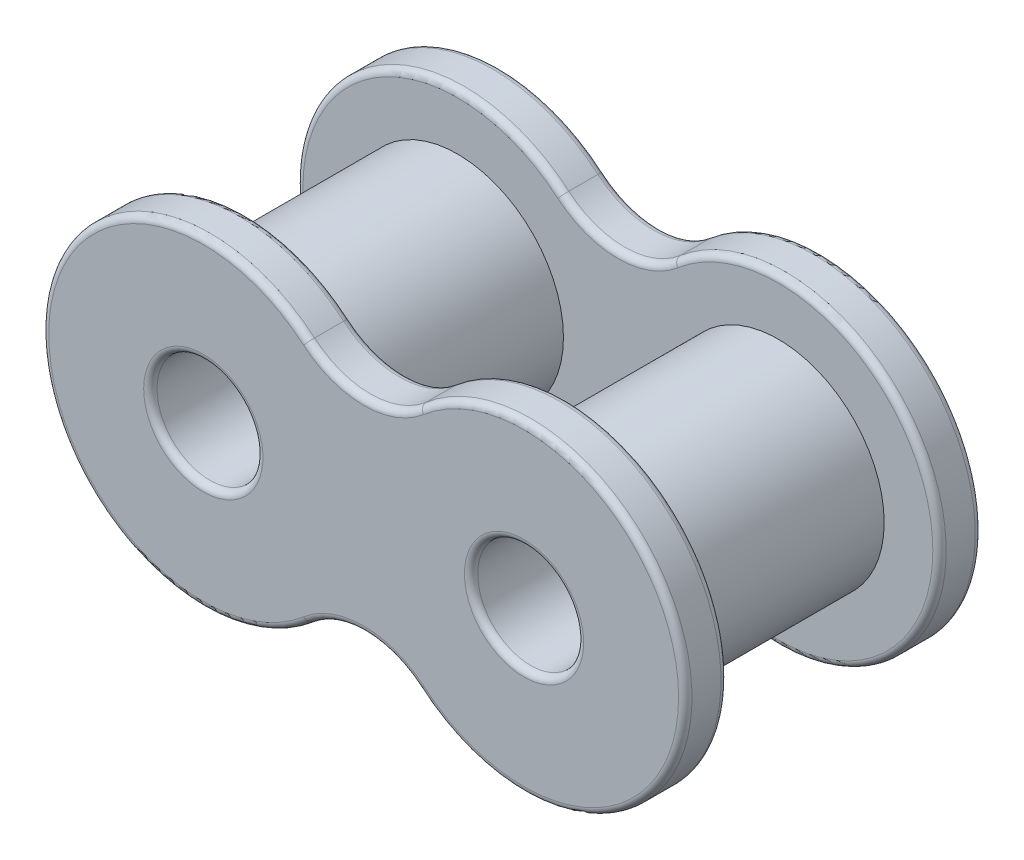
ISO-10303-21;
HEADER;
FILE_DESCRIPTION(('STEP AP214'),'2;1');
FILE_NAME('part.step','',(''),(''),'','','');
FILE_SCHEMA(('AUTOMOTIVE_DESIGN { 1 0 10303 214 1 1 1 1 }'));
ENDSEC;
DATA;
#1=APPLICATION_CONTEXT('core data for automotive mechanical design processes');
#2=APPLICATION_PROTOCOL_DEFINITION('international standard','automotive_design',2000,#1);
#3=PRODUCT_CONTEXT('',#1,'mechanical');
#4=PRODUCT('Part','Part','',(#3));
#5=PRODUCT_RELATED_PRODUCT_CATEGORY('part','',(#4));
#6=PRODUCT_DEFINITION_FORMATION('','',#4);
#7=PRODUCT_DEFINITION_CONTEXT('part definition',#1,'design');
#8=PRODUCT_DEFINITION('design','',#6,#7);
#9=PRODUCT_DEFINITION_SHAPE('','',#8);
#10=(LENGTH_UNIT() NAMED_UNIT(*) SI_UNIT(.MILLI.,.METRE.));
#11=(NAMED_UNIT(*) PLANE_ANGLE_UNIT() SI_UNIT($,.RADIAN.));
#12=(NAMED_UNIT(*) SI_UNIT($,.STERADIAN.) SOLID_ANGLE_UNIT());
#13=UNCERTAINTY_MEASURE_WITH_UNIT(LENGTH_MEASURE(1.E-05),#10,'distance_accuracy_value','');
#14=(GEOMETRIC_REPRESENTATION_CONTEXT(3) GLOBAL_UNCERTAINTY_ASSIGNED_CONTEXT((#13)) GLOBAL_UNIT_ASSIGNED_CONTEXT((#10,
#11,#12)) REPRESENTATION_CONTEXT('',''));
#15=CARTESIAN_POINT('',(0.,0.,0.));
#16=DIRECTION('',(0.,0.,1.));
#17=DIRECTION('',(1.,0.,0.));
#18=AXIS2_PLACEMENT_3D('',#15,#16,#17);
#19=CARTESIAN_POINT('',(3.,3.5177961772624,1.5875));
#20=DIRECTION('',(0.,0.,1.));
#21=DIRECTION('',(1.,0.,0.));
#22=AXIS2_PLACEMENT_3D('',#19,#20,#21);
#23=PLANE('',#22);
#24=CARTESIAN_POINT('',(6.,0.,1.5875));
#25=DIRECTION('',(0.,0.,1.));
#26=DIRECTION('',(1.,0.,0.));
#27=AXIS2_PLACEMENT_3D('',#24,#25,#26);
#28=CIRCLE('',#27,3.9624);
#29=CARTESIAN_POINT('',(9.9624,0.,1.5875));
#30=VERTEX_POINT('',#29);
#31=EDGE_CURVE('E160',#30,#30,#28,.T.);
#32=ORIENTED_EDGE('',*,*,#31,.F.);
#33=EDGE_LOOP('',(#32));
#34=FACE_BOUND('',#33,.T.);
#35=CARTESIAN_POINT('',(6.,0.,1.5875));
#36=DIRECTION('',(0.,0.,1.));
#37=DIRECTION('',(1.,0.,0.));
#38=AXIS2_PLACEMENT_3D('',#35,#36,#37);
#39=CIRCLE('',#38,5.7825);
#40=CARTESIAN_POINT('',(2.24780886962395,-4.39981453826491,1.5875));
#41=VERTEX_POINT('',#40);
#42=CARTESIAN_POINT('',(2.24780886962395,4.39981453826491,1.5875));
#43=VERTEX_POINT('',#42);
#44=EDGE_CURVE('E187',#41,#43,#39,.T.);
#45=ORIENTED_EDGE('',*,*,#44,.T.);
#46=CARTESIAN_POINT('',(0.,7.0355923545248,1.5875));
#47=DIRECTION('',(0.,0.,1.));
#48=DIRECTION('',(1.,0.,0.));
#49=AXIS2_PLACEMENT_3D('',#46,#47,#48);
#50=CIRCLE('',#49,3.4640972);
#51=CARTESIAN_POINT('',(-2.24780886962395,4.39981453826491,1.5875));
#52=VERTEX_POINT('',#51);
#53=EDGE_CURVE('E307',#43,#52,#50,.F.);
#54=ORIENTED_EDGE('',*,*,#53,.T.);
#55=CARTESIAN_POINT('',(-6.,0.,1.5875));
#56=DIRECTION('',(0.,0.,1.));
#57=DIRECTION('',(1.,0.,0.));
#58=AXIS2_PLACEMENT_3D('',#55,#56,#57);
#59=CIRCLE('',#58,5.7825);
#60=CARTESIAN_POINT('',(-2.24780886962395,-4.39981453826492,1.5875));
#61=VERTEX_POINT('',#60);
#62=EDGE_CURVE('E329',#52,#61,#59,.T.);
#63=ORIENTED_EDGE('',*,*,#62,.T.);
#64=CARTESIAN_POINT('',(0.,-7.0355923545248,1.5875));
#65=DIRECTION('',(0.,0.,1.));
#66=DIRECTION('',(1.,0.,0.));
#67=AXIS2_PLACEMENT_3D('',#64,#65,#66);
#68=CIRCLE('',#67,3.4640972);
#69=EDGE_CURVE('E330',#61,#41,#68,.F.);
#70=ORIENTED_EDGE('',*,*,#69,.T.);
#71=EDGE_LOOP('',(#45,#54,#63,#70));
#72=FACE_BOUND('',#71,.T.);
#73=CARTESIAN_POINT('',(-6.,0.,1.5875));
#74=DIRECTION('',(0.,0.,1.));
#75=DIRECTION('',(1.,0.,0.));
#76=AXIS2_PLACEMENT_3D('',#73,#74,#75);
#77=CIRCLE('',#76,3.9624);
#78=CARTESIAN_POINT('',(-2.0376,0.,1.5875));
#79=VERTEX_POINT('',#78);
#80=EDGE_CURVE('E347',#79,#79,#77,.T.);
#81=ORIENTED_EDGE('',*,*,#80,.F.);
#82=EDGE_LOOP('',(#81));
#83=FACE_BOUND('',#82,.T.);
#84=ADVANCED_FACE('F34',(#34,#72,#83),#23,.T.);
#85=CARTESIAN_POINT('',(3.,3.5177961772624,0.));
#86=DIRECTION('',(0.,0.,1.));
#87=DIRECTION('',(1.,0.,0.));
#88=AXIS2_PLACEMENT_3D('',#85,#86,#87);
#89=PLANE('',#88);
#90=CARTESIAN_POINT('',(6.,0.,0.));
#91=DIRECTION('',(0.,0.,1.));
#92=DIRECTION('',(1.,0.,0.));
#93=AXIS2_PLACEMENT_3D('',#90,#91,#92);
#94=CIRCLE('',#93,2.2312);
#95=CARTESIAN_POINT('',(8.2312,0.,0.));
#96=VERTEX_POINT('',#95);
#97=EDGE_CURVE('E267',#96,#96,#94,.T.);
#98=ORIENTED_EDGE('',*,*,#97,.T.);
#99=EDGE_LOOP('',(#98));
#100=FACE_BOUND('',#99,.T.);
#101=CARTESIAN_POINT('',(-6.,0.,0.));
#102=DIRECTION('',(0.,0.,1.));
#103=DIRECTION('',(1.,0.,0.));
#104=AXIS2_PLACEMENT_3D('',#101,#102,#103);
#105=CIRCLE('',#104,2.2312);
#106=CARTESIAN_POINT('',(-3.7688,0.,0.));
#107=VERTEX_POINT('',#106);
#108=EDGE_CURVE('E264',#107,#107,#105,.T.);
#109=ORIENTED_EDGE('',*,*,#108,.T.);
#110=EDGE_LOOP('',(#109));
#111=FACE_BOUND('',#110,.T.);
#112=CARTESIAN_POINT('',(6.,0.,0.));
#113=DIRECTION('',(0.,0.,1.));
#114=DIRECTION('',(1.,0.,0.));
#115=AXIS2_PLACEMENT_3D('',#112,#113,#114);
#116=CIRCLE('',#115,5.7825);
#117=CARTESIAN_POINT('',(2.24780886962395,4.39981453826491,0.));
#118=VERTEX_POINT('',#117);
#119=CARTESIAN_POINT('',(2.24780886962395,-4.39981453826491,0.));
#120=VERTEX_POINT('',#119);
#121=EDGE_CURVE('E287',#118,#120,#116,.F.);
#122=ORIENTED_EDGE('',*,*,#121,.T.);
#123=CARTESIAN_POINT('',(0.,-7.0355923545248,0.));
#124=DIRECTION('',(0.,0.,1.));
#125=DIRECTION('',(1.,0.,0.));
#126=AXIS2_PLACEMENT_3D('',#123,#124,#125);
#127=CIRCLE('',#126,3.4640972);
#128=CARTESIAN_POINT('',(-2.24780886962395,-4.39981453826492,0.));
#129=VERTEX_POINT('',#128);
#130=EDGE_CURVE('E289',#120,#129,#127,.T.);
#131=ORIENTED_EDGE('',*,*,#130,.T.);
#132=CARTESIAN_POINT('',(-6.,0.,0.));
#133=DIRECTION('',(0.,0.,1.));
#134=DIRECTION('',(1.,0.,0.));
#135=AXIS2_PLACEMENT_3D('',#132,#133,#134);
#136=CIRCLE('',#135,5.7825);
#137=CARTESIAN_POINT('',(-2.24780886962395,4.39981453826491,0.));
#138=VERTEX_POINT('',#137);
#139=EDGE_CURVE('E303',#129,#138,#136,.F.);
#140=ORIENTED_EDGE('',*,*,#139,.T.);
#141=CARTESIAN_POINT('',(0.,7.0355923545248,0.));
#142=DIRECTION('',(0.,0.,1.));
#143=DIRECTION('',(1.,0.,0.));
#144=AXIS2_PLACEMENT_3D('',#141,#142,#143);
#145=CIRCLE('',#144,3.4640972);
#146=EDGE_CURVE('E291',#138,#118,#145,.T.);
#147=ORIENTED_EDGE('',*,*,#146,.T.);
#148=EDGE_LOOP('',(#122,#131,#140,#147));
#149=FACE_BOUND('',#148,.T.);
#150=ADVANCED_FACE('F279',(#100,#111,#149),#89,.F.);
#151=CARTESIAN_POINT('',(0.,7.0355923545248,1.5875));
#152=DIRECTION('',(0.,0.,-1.));
#153=DIRECTION('',(-1.,0.,0.));
#154=AXIS2_PLACEMENT_3D('',#151,#152,#153);
#155=CYLINDRICAL_SURFACE('',#154,3.2140972);
#156=DIRECTION('',(0.,0.,-1.));
#157=VECTOR('',#156,1.);
#158=CARTESIAN_POINT('',(2.08558703087012,4.59003565967714,1.5875));
#159=LINE('',#158,#157);
#160=CARTESIAN_POINT('',(2.08558703087012,4.59003565967714,1.3375));
#161=VERTEX_POINT('',#160);
#162=CARTESIAN_POINT('',(2.08558703087012,4.59003565967714,0.25));
#163=VERTEX_POINT('',#162);
#164=EDGE_CURVE('E155',#161,#163,#159,.T.);
#165=ORIENTED_EDGE('',*,*,#164,.T.);
#166=CARTESIAN_POINT('',(0.,7.0355923545248,0.25));
#167=DIRECTION('',(0.,0.,1.));
#168=DIRECTION('',(1.,0.,0.));
#169=AXIS2_PLACEMENT_3D('',#166,#167,#168);
#170=CIRCLE('',#169,3.2140972);
#171=CARTESIAN_POINT('',(-2.08558703087012,4.59003565967715,0.25));
#172=VERTEX_POINT('',#171);
#173=EDGE_CURVE('E334',#163,#172,#170,.F.);
#174=ORIENTED_EDGE('',*,*,#173,.T.);
#175=DIRECTION('',(0.,0.,-1.));
#176=VECTOR('',#175,1.);
#177=CARTESIAN_POINT('',(-2.08558703087012,4.59003565967715,1.5875));
#178=LINE('',#177,#176);
#179=CARTESIAN_POINT('',(-2.08558703087012,4.59003565967715,1.3375));
#180=VERTEX_POINT('',#179);
#181=EDGE_CURVE('E184',#180,#172,#178,.T.);
#182=ORIENTED_EDGE('',*,*,#181,.F.);
#183=CARTESIAN_POINT('',(0.,7.0355923545248,1.3375));
#184=DIRECTION('',(0.,0.,1.));
#185=DIRECTION('',(1.,0.,0.));
#186=AXIS2_PLACEMENT_3D('',#183,#184,#185);
#187=CIRCLE('',#186,3.2140972);
#188=EDGE_CURVE('E324',#180,#161,#187,.T.);
#189=ORIENTED_EDGE('',*,*,#188,.T.);
#190=EDGE_LOOP('',(#165,#174,#182,#189));
#191=FACE_BOUND('',#190,.T.);
#192=ADVANCED_FACE('F282',(#191),#155,.F.);
#193=CARTESIAN_POINT('',(-6.,0.,1.5875));
#194=DIRECTION('',(0.,0.,-1.));
#195=DIRECTION('',(-1.,0.,0.));
#196=AXIS2_PLACEMENT_3D('',#193,#194,#195);
#197=CYLINDRICAL_SURFACE('',#196,6.0325);
#198=ORIENTED_EDGE('',*,*,#181,.T.);
#199=CARTESIAN_POINT('',(-6.,0.,0.25));
#200=DIRECTION('',(0.,0.,1.));
#201=DIRECTION('',(1.,0.,0.));
#202=AXIS2_PLACEMENT_3D('',#199,#200,#201);
#203=CIRCLE('',#202,6.0325);
#204=CARTESIAN_POINT('',(-2.08558703087012,-4.59003565967715,0.25));
#205=VERTEX_POINT('',#204);
#206=EDGE_CURVE('E337',#172,#205,#203,.T.);
#207=ORIENTED_EDGE('',*,*,#206,.T.);
#208=DIRECTION('',(0.,0.,-1.));
#209=VECTOR('',#208,1.);
#210=CARTESIAN_POINT('',(-2.08558703087012,-4.59003565967715,1.5875));
#211=LINE('',#210,#209);
#212=CARTESIAN_POINT('',(-2.08558703087012,-4.59003565967715,1.3375));
#213=VERTEX_POINT('',#212);
#214=EDGE_CURVE('E172',#213,#205,#211,.T.);
#215=ORIENTED_EDGE('',*,*,#214,.F.);
#216=CARTESIAN_POINT('',(-6.,0.,1.3375));
#217=DIRECTION('',(0.,0.,1.));
#218=DIRECTION('',(1.,0.,0.));
#219=AXIS2_PLACEMENT_3D('',#216,#217,#218);
#220=CIRCLE('',#219,6.0325);
#221=EDGE_CURVE('E302',#213,#180,#220,.F.);
#222=ORIENTED_EDGE('',*,*,#221,.T.);
#223=EDGE_LOOP('',(#198,#207,#215,#222));
#224=FACE_BOUND('',#223,.T.);
#225=ADVANCED_FACE('F425',(#224),#197,.T.);
#226=CARTESIAN_POINT('',(0.,-7.0355923545248,1.5875));
#227=DIRECTION('',(0.,0.,-1.));
#228=DIRECTION('',(-1.,0.,0.));
#229=AXIS2_PLACEMENT_3D('',#226,#227,#228);
#230=CYLINDRICAL_SURFACE('',#229,3.2140972);
#231=ORIENTED_EDGE('',*,*,#214,.T.);
#232=CARTESIAN_POINT('',(0.,-7.0355923545248,0.25));
#233=DIRECTION('',(0.,0.,1.));
#234=DIRECTION('',(1.,0.,0.));
#235=AXIS2_PLACEMENT_3D('',#232,#233,#234);
#236=CIRCLE('',#235,3.2140972);
#237=CARTESIAN_POINT('',(2.08558703087013,-4.59003565967715,0.25));
#238=VERTEX_POINT('',#237);
#239=EDGE_CURVE('E171',#205,#238,#236,.F.);
#240=ORIENTED_EDGE('',*,*,#239,.T.);
#241=DIRECTION('',(0.,0.,-1.));
#242=VECTOR('',#241,1.);
#243=CARTESIAN_POINT('',(2.08558703087013,-4.59003565967715,1.5875));
#244=LINE('',#243,#242);
#245=CARTESIAN_POINT('',(2.08558703087013,-4.59003565967715,1.3375));
#246=VERTEX_POINT('',#245);
#247=EDGE_CURVE('E153',#246,#238,#244,.T.);
#248=ORIENTED_EDGE('',*,*,#247,.F.);
#249=CARTESIAN_POINT('',(0.,-7.0355923545248,1.3375));
#250=DIRECTION('',(0.,0.,1.));
#251=DIRECTION('',(1.,0.,0.));
#252=AXIS2_PLACEMENT_3D('',#249,#250,#251);
#253=CIRCLE('',#252,3.2140972);
#254=EDGE_CURVE('E168',#246,#213,#253,.T.);
#255=ORIENTED_EDGE('',*,*,#254,.T.);
#256=EDGE_LOOP('',(#231,#240,#248,#255));
#257=FACE_BOUND('',#256,.T.);
#258=ADVANCED_FACE('F167',(#257),#230,.F.);
#259=CARTESIAN_POINT('',(6.,0.,1.5875));
#260=DIRECTION('',(0.,0.,-1.));
#261=DIRECTION('',(-1.,0.,0.));
#262=AXIS2_PLACEMENT_3D('',#259,#260,#261);
#263=CYLINDRICAL_SURFACE('',#262,6.0325);
#264=ORIENTED_EDGE('',*,*,#164,.F.);
#265=CARTESIAN_POINT('',(6.,0.,1.3375));
#266=DIRECTION('',(0.,0.,1.));
#267=DIRECTION('',(1.,0.,0.));
#268=AXIS2_PLACEMENT_3D('',#265,#266,#267);
#269=CIRCLE('',#268,6.0325);
#270=EDGE_CURVE('E150',#161,#246,#269,.F.);
#271=ORIENTED_EDGE('',*,*,#270,.T.);
#272=ORIENTED_EDGE('',*,*,#247,.T.);
#273=CARTESIAN_POINT('',(6.,0.,0.25));
#274=DIRECTION('',(0.,0.,1.));
#275=DIRECTION('',(1.,0.,0.));
#276=AXIS2_PLACEMENT_3D('',#273,#274,#275);
#277=CIRCLE('',#276,6.0325);
#278=EDGE_CURVE('E161',#238,#163,#277,.T.);
#279=ORIENTED_EDGE('',*,*,#278,.T.);
#280=EDGE_LOOP('',(#264,#271,#272,#279));
#281=FACE_BOUND('',#280,.T.);
#282=ADVANCED_FACE('F152',(#281),#263,.T.);
#283=CARTESIAN_POINT('',(-6.,0.,1.5875));
#284=DIRECTION('',(0.,0.,-1.));
#285=DIRECTION('',(-1.,0.,0.));
#286=AXIS2_PLACEMENT_3D('',#283,#284,#285);
#287=CYLINDRICAL_SURFACE('',#286,1.9812);
#288=CARTESIAN_POINT('',(-6.,0.,10.8498));
#289=DIRECTION('',(0.,0.,-1.));
#290=DIRECTION('',(-1.,0.,0.));
#291=AXIS2_PLACEMENT_3D('',#288,#289,#290);
#292=CIRCLE('',#291,1.9812);
#293=CARTESIAN_POINT('',(-7.9812,0.,10.8498));
#294=VERTEX_POINT('',#293);
#295=EDGE_CURVE('E11',#294,#294,#292,.F.);
#296=ORIENTED_EDGE('',*,*,#295,.T.);
#297=EDGE_LOOP('',(#296));
#298=FACE_BOUND('',#297,.T.);
#299=CARTESIAN_POINT('',(-6.,0.,0.25));
#300=DIRECTION('',(0.,0.,1.));
#301=DIRECTION('',(1.,0.,0.));
#302=AXIS2_PLACEMENT_3D('',#299,#300,#301);
#303=CIRCLE('',#302,1.9812);
#304=CARTESIAN_POINT('',(-4.0188,0.,0.25));
#305=VERTEX_POINT('',#304);
#306=EDGE_CURVE('E42',#305,#305,#303,.F.);
#307=ORIENTED_EDGE('',*,*,#306,.T.);
#308=EDGE_LOOP('',(#307));
#309=FACE_BOUND('',#308,.T.);
#310=ADVANCED_FACE('F272',(#298,#309),#287,.F.);
#311=CARTESIAN_POINT('',(6.,0.,1.5875));
#312=DIRECTION('',(0.,0.,-1.));
#313=DIRECTION('',(-1.,0.,0.));
#314=AXIS2_PLACEMENT_3D('',#311,#312,#313);
#315=CYLINDRICAL_SURFACE('',#314,1.9812);
#316=CARTESIAN_POINT('',(6.,0.,10.8498));
#317=DIRECTION('',(0.,0.,-1.));
#318=DIRECTION('',(-1.,0.,0.));
#319=AXIS2_PLACEMENT_3D('',#316,#317,#318);
#320=CIRCLE('',#319,1.9812);
#321=CARTESIAN_POINT('',(4.0188,0.,10.8498));
#322=VERTEX_POINT('',#321);
#323=EDGE_CURVE('E255',#322,#322,#320,.F.);
#324=ORIENTED_EDGE('',*,*,#323,.T.);
#325=EDGE_LOOP('',(#324));
#326=FACE_BOUND('',#325,.T.);
#327=CARTESIAN_POINT('',(6.,0.,0.25));
#328=DIRECTION('',(0.,0.,1.));
#329=DIRECTION('',(1.,0.,0.));
#330=AXIS2_PLACEMENT_3D('',#327,#328,#329);
#331=CIRCLE('',#330,1.9812);
#332=CARTESIAN_POINT('',(7.9812,0.,0.25));
#333=VERTEX_POINT('',#332);
#334=EDGE_CURVE('E232',#333,#333,#331,.F.);
#335=ORIENTED_EDGE('',*,*,#334,.T.);
#336=EDGE_LOOP('',(#335));
#337=FACE_BOUND('',#336,.T.);
#338=ADVANCED_FACE('F443',(#326,#337),#315,.F.);
#339=CARTESIAN_POINT('',(0.,7.0355923545248,0.25));
#340=DIRECTION('',(0.,0.,1.));
#341=DIRECTION('',(1.,0.,0.));
#342=AXIS2_PLACEMENT_3D('',#339,#340,#341);
#343=TOROIDAL_SURFACE('',#342,3.4640972,0.25);
#344=CARTESIAN_POINT('',(2.24780886962395,4.39981453826491,0.25));
#345=DIRECTION('',(0.760884485648928,0.648887355015312,0.));
#346=DIRECTION('',(-0.648887355015312,0.760884485648928,0.));
#347=AXIS2_PLACEMENT_3D('',#344,#345,#346);
#348=CIRCLE('',#347,0.25);
#349=EDGE_CURVE('E306',#118,#163,#348,.T.);
#350=ORIENTED_EDGE('',*,*,#349,.F.);
#351=ORIENTED_EDGE('',*,*,#146,.F.);
#352=CARTESIAN_POINT('',(-2.24780886962395,4.39981453826491,0.25));
#353=DIRECTION('',(-0.760884485648927,0.648887355015313,0.));
#354=DIRECTION('',(-0.648887355015313,-0.760884485648927,0.));
#355=AXIS2_PLACEMENT_3D('',#352,#353,#354);
#356=CIRCLE('',#355,0.25);
#357=EDGE_CURVE('E315',#172,#138,#356,.T.);
#358=ORIENTED_EDGE('',*,*,#357,.F.);
#359=ORIENTED_EDGE('',*,*,#173,.F.);
#360=EDGE_LOOP('',(#350,#351,#358,#359));
#361=FACE_BOUND('',#360,.T.);
#362=ADVANCED_FACE('F439',(#361),#343,.T.);
#363=CARTESIAN_POINT('',(-6.,0.,0.25));
#364=DIRECTION('',(0.,0.,1.));
#365=DIRECTION('',(1.,0.,0.));
#366=AXIS2_PLACEMENT_3D('',#363,#364,#365);
#367=TOROIDAL_SURFACE('',#366,5.7825,0.25);
#368=ORIENTED_EDGE('',*,*,#357,.T.);
#369=ORIENTED_EDGE('',*,*,#139,.F.);
#370=CARTESIAN_POINT('',(-2.24780886962395,-4.39981453826492,0.25));
#371=DIRECTION('',(0.760884485648927,0.648887355015313,0.));
#372=DIRECTION('',(-0.648887355015313,0.760884485648927,0.));
#373=AXIS2_PLACEMENT_3D('',#370,#371,#372);
#374=CIRCLE('',#373,0.25);
#375=EDGE_CURVE('E190',#205,#129,#374,.T.);
#376=ORIENTED_EDGE('',*,*,#375,.F.);
#377=ORIENTED_EDGE('',*,*,#206,.F.);
#378=EDGE_LOOP('',(#368,#369,#376,#377));
#379=FACE_BOUND('',#378,.T.);
#380=ADVANCED_FACE('F436',(#379),#367,.T.);
#381=CARTESIAN_POINT('',(6.,0.,0.25));
#382=DIRECTION('',(0.,0.,1.));
#383=DIRECTION('',(1.,0.,0.));
#384=AXIS2_PLACEMENT_3D('',#381,#382,#383);
#385=TOROIDAL_SURFACE('',#384,5.7825,0.25);
#386=ORIENTED_EDGE('',*,*,#349,.T.);
#387=ORIENTED_EDGE('',*,*,#278,.F.);
#388=CARTESIAN_POINT('',(2.24780886962395,-4.39981453826491,0.25));
#389=DIRECTION('',(-0.760884485648927,0.648887355015312,0.));
#390=DIRECTION('',(-0.648887355015312,-0.760884485648927,0.));
#391=AXIS2_PLACEMENT_3D('',#388,#389,#390);
#392=CIRCLE('',#391,0.25);
#393=EDGE_CURVE('E188',#120,#238,#392,.T.);
#394=ORIENTED_EDGE('',*,*,#393,.F.);
#395=ORIENTED_EDGE('',*,*,#121,.F.);
#396=EDGE_LOOP('',(#386,#387,#394,#395));
#397=FACE_BOUND('',#396,.T.);
#398=ADVANCED_FACE('F305',(#397),#385,.T.);
#399=CARTESIAN_POINT('',(0.,-7.0355923545248,0.25));
#400=DIRECTION('',(0.,0.,1.));
#401=DIRECTION('',(1.,0.,0.));
#402=AXIS2_PLACEMENT_3D('',#399,#400,#401);
#403=TOROIDAL_SURFACE('',#402,3.4640972,0.25);
#404=ORIENTED_EDGE('',*,*,#375,.T.);
#405=ORIENTED_EDGE('',*,*,#130,.F.);
#406=ORIENTED_EDGE('',*,*,#393,.T.);
#407=ORIENTED_EDGE('',*,*,#239,.F.);
#408=EDGE_LOOP('',(#404,#405,#406,#407));
#409=FACE_BOUND('',#408,.T.);
#410=ADVANCED_FACE('F298',(#409),#403,.T.);
#411=CARTESIAN_POINT('',(0.,-7.0355923545248,1.3375));
#412=DIRECTION('',(0.,0.,1.));
#413=DIRECTION('',(1.,0.,0.));
#414=AXIS2_PLACEMENT_3D('',#411,#412,#413);
#415=TOROIDAL_SURFACE('',#414,3.4640972,0.25);
#416=CARTESIAN_POINT('',(-2.24780886962395,-4.39981453826492,1.3375));
#417=DIRECTION('',(-0.760884485648927,-0.648887355015313,0.));
#418=DIRECTION('',(0.648887355015313,-0.760884485648927,0.));
#419=AXIS2_PLACEMENT_3D('',#416,#417,#418);
#420=CIRCLE('',#419,0.25);
#421=EDGE_CURVE('E182',#213,#61,#420,.T.);
#422=ORIENTED_EDGE('',*,*,#421,.F.);
#423=ORIENTED_EDGE('',*,*,#254,.F.);
#424=CARTESIAN_POINT('',(2.24780886962395,-4.39981453826491,1.3375));
#425=DIRECTION('',(0.760884485648928,-0.648887355015312,0.));
#426=DIRECTION('',(0.648887355015312,0.760884485648928,0.));
#427=AXIS2_PLACEMENT_3D('',#424,#425,#426);
#428=CIRCLE('',#427,0.25);
#429=EDGE_CURVE('E179',#41,#246,#428,.T.);
#430=ORIENTED_EDGE('',*,*,#429,.F.);
#431=ORIENTED_EDGE('',*,*,#69,.F.);
#432=EDGE_LOOP('',(#422,#423,#430,#431));
#433=FACE_BOUND('',#432,.T.);
#434=ADVANCED_FACE('F177',(#433),#415,.T.);
#435=CARTESIAN_POINT('',(6.,0.,1.3375));
#436=DIRECTION('',(0.,0.,1.));
#437=DIRECTION('',(1.,0.,0.));
#438=AXIS2_PLACEMENT_3D('',#435,#436,#437);
#439=TOROIDAL_SURFACE('',#438,5.7825,0.25);
#440=ORIENTED_EDGE('',*,*,#429,.T.);
#441=ORIENTED_EDGE('',*,*,#270,.F.);
#442=CARTESIAN_POINT('',(2.24780886962395,4.39981453826491,1.3375));
#443=DIRECTION('',(-0.760884485648927,-0.648887355015313,0.));
#444=DIRECTION('',(0.648887355015313,-0.760884485648927,0.));
#445=AXIS2_PLACEMENT_3D('',#442,#443,#444);
#446=CIRCLE('',#445,0.25);
#447=EDGE_CURVE('E192',#43,#161,#446,.T.);
#448=ORIENTED_EDGE('',*,*,#447,.F.);
#449=ORIENTED_EDGE('',*,*,#44,.F.);
#450=EDGE_LOOP('',(#440,#441,#448,#449));
#451=FACE_BOUND('',#450,.T.);
#452=ADVANCED_FACE('F186',(#451),#439,.T.);
#453=CARTESIAN_POINT('',(-6.,0.,1.3375));
#454=DIRECTION('',(0.,0.,1.));
#455=DIRECTION('',(1.,0.,0.));
#456=AXIS2_PLACEMENT_3D('',#453,#454,#455);
#457=TOROIDAL_SURFACE('',#456,5.7825,0.25);
#458=ORIENTED_EDGE('',*,*,#421,.T.);
#459=ORIENTED_EDGE('',*,*,#62,.F.);
#460=CARTESIAN_POINT('',(-2.24780886962395,4.39981453826491,1.3375));
#461=DIRECTION('',(0.760884485648927,-0.648887355015313,0.));
#462=DIRECTION('',(0.648887355015313,0.760884485648927,0.));
#463=AXIS2_PLACEMENT_3D('',#460,#461,#462);
#464=CIRCLE('',#463,0.25);
#465=EDGE_CURVE('E318',#180,#52,#464,.T.);
#466=ORIENTED_EDGE('',*,*,#465,.F.);
#467=ORIENTED_EDGE('',*,*,#221,.F.);
#468=EDGE_LOOP('',(#458,#459,#466,#467));
#469=FACE_BOUND('',#468,.T.);
#470=ADVANCED_FACE('F448',(#469),#457,.T.);
#471=CARTESIAN_POINT('',(0.,7.0355923545248,1.3375));
#472=DIRECTION('',(0.,0.,1.));
#473=DIRECTION('',(1.,0.,0.));
#474=AXIS2_PLACEMENT_3D('',#471,#472,#473);
#475=TOROIDAL_SURFACE('',#474,3.4640972,0.25);
#476=ORIENTED_EDGE('',*,*,#447,.T.);
#477=ORIENTED_EDGE('',*,*,#188,.F.);
#478=ORIENTED_EDGE('',*,*,#465,.T.);
#479=ORIENTED_EDGE('',*,*,#53,.F.);
#480=EDGE_LOOP('',(#476,#477,#478,#479));
#481=FACE_BOUND('',#480,.T.);
#482=ADVANCED_FACE('F323',(#481),#475,.T.);
#483=CARTESIAN_POINT('',(-6.,0.,9.5123));
#484=DIRECTION('',(0.,0.,-1.));
#485=DIRECTION('',(-1.,0.,0.));
#486=AXIS2_PLACEMENT_3D('',#483,#484,#485);
#487=CYLINDRICAL_SURFACE('',#486,3.9624);
#488=CARTESIAN_POINT('',(-6.,0.,9.5123));
#489=DIRECTION('',(0.,0.,1.));
#490=DIRECTION('',(1.,0.,0.));
#491=AXIS2_PLACEMENT_3D('',#488,#489,#490);
#492=CIRCLE('',#491,3.9624);
#493=CARTESIAN_POINT('',(-2.0376,0.,9.5123));
#494=VERTEX_POINT('',#493);
#495=EDGE_CURVE('E319',#494,#494,#492,.T.);
#496=ORIENTED_EDGE('',*,*,#495,.F.);
#497=EDGE_LOOP('',(#496));
#498=FACE_BOUND('',#497,.T.);
#499=ORIENTED_EDGE('',*,*,#80,.T.);
#500=EDGE_LOOP('',(#499));
#501=FACE_BOUND('',#500,.T.);
#502=ADVANCED_FACE('F447',(#498,#501),#487,.T.);
#503=CARTESIAN_POINT('',(6.,0.,9.5123));
#504=DIRECTION('',(0.,0.,-1.));
#505=DIRECTION('',(-1.,0.,0.));
#506=AXIS2_PLACEMENT_3D('',#503,#504,#505);
#507=CYLINDRICAL_SURFACE('',#506,3.9624);
#508=CARTESIAN_POINT('',(6.,0.,9.5123));
#509=DIRECTION('',(0.,0.,-1.));
#510=DIRECTION('',(-1.,0.,0.));
#511=AXIS2_PLACEMENT_3D('',#508,#509,#510);
#512=CIRCLE('',#511,3.9624);
#513=CARTESIAN_POINT('',(2.0376,0.,9.5123));
#514=VERTEX_POINT('',#513);
#515=EDGE_CURVE('E350',#514,#514,#512,.T.);
#516=ORIENTED_EDGE('',*,*,#515,.T.);
#517=EDGE_LOOP('',(#516));
#518=FACE_BOUND('',#517,.T.);
#519=ORIENTED_EDGE('',*,*,#31,.T.);
#520=EDGE_LOOP('',(#519));
#521=FACE_BOUND('',#520,.T.);
#522=ADVANCED_FACE('F476',(#518,#521),#507,.T.);
#523=CARTESIAN_POINT('',(3.,3.5177961772624,9.5123));
#524=DIRECTION('',(0.,0.,-1.));
#525=DIRECTION('',(1.,0.,0.));
#526=AXIS2_PLACEMENT_3D('',#523,#524,#525);
#527=PLANE('',#526);
#528=CARTESIAN_POINT('',(-6.,0.,9.5123));
#529=DIRECTION('',(0.,0.,-1.));
#530=DIRECTION('',(-1.,0.,0.));
#531=AXIS2_PLACEMENT_3D('',#528,#529,#530);
#532=CIRCLE('',#531,5.7825);
#533=CARTESIAN_POINT('',(-2.24780886962395,-4.39981453826492,9.5123));
#534=VERTEX_POINT('',#533);
#535=CARTESIAN_POINT('',(-2.24780886962395,4.39981453826491,9.5123));
#536=VERTEX_POINT('',#535);
#537=EDGE_CURVE('E221',#534,#536,#532,.T.);
#538=ORIENTED_EDGE('',*,*,#537,.T.);
#539=CARTESIAN_POINT('',(0.,7.0355923545248,9.5123));
#540=DIRECTION('',(0.,0.,-1.));
#541=DIRECTION('',(-1.,0.,0.));
#542=AXIS2_PLACEMENT_3D('',#539,#540,#541);
#543=CIRCLE('',#542,3.4640972);
#544=CARTESIAN_POINT('',(2.24780886962395,4.39981453826491,9.5123));
#545=VERTEX_POINT('',#544);
#546=EDGE_CURVE('E226',#536,#545,#543,.F.);
#547=ORIENTED_EDGE('',*,*,#546,.T.);
#548=CARTESIAN_POINT('',(6.,0.,9.5123));
#549=DIRECTION('',(0.,0.,-1.));
#550=DIRECTION('',(-1.,0.,0.));
#551=AXIS2_PLACEMENT_3D('',#548,#549,#550);
#552=CIRCLE('',#551,5.7825);
#553=CARTESIAN_POINT('',(2.24780886962395,-4.39981453826491,9.5123));
#554=VERTEX_POINT('',#553);
#555=EDGE_CURVE('E56',#545,#554,#552,.T.);
#556=ORIENTED_EDGE('',*,*,#555,.T.);
#557=CARTESIAN_POINT('',(0.,-7.0355923545248,9.5123));
#558=DIRECTION('',(0.,0.,-1.));
#559=DIRECTION('',(-1.,0.,0.));
#560=AXIS2_PLACEMENT_3D('',#557,#558,#559);
#561=CIRCLE('',#560,3.4640972);
#562=EDGE_CURVE('E223',#554,#534,#561,.F.);
#563=ORIENTED_EDGE('',*,*,#562,.T.);
#564=EDGE_LOOP('',(#538,#547,#556,#563));
#565=FACE_BOUND('',#564,.T.);
#566=ORIENTED_EDGE('',*,*,#515,.F.);
#567=EDGE_LOOP('',(#566));
#568=FACE_BOUND('',#567,.T.);
#569=ORIENTED_EDGE('',*,*,#495,.T.);
#570=EDGE_LOOP('',(#569));
#571=FACE_BOUND('',#570,.T.);
#572=ADVANCED_FACE('F484',(#565,#568,#571),#527,.T.);
#573=CARTESIAN_POINT('',(0.,7.0355923545248,9.5123));
#574=DIRECTION('',(0.,0.,1.));
#575=DIRECTION('',(1.,0.,0.));
#576=AXIS2_PLACEMENT_3D('',#573,#574,#575);
#577=CYLINDRICAL_SURFACE('',#576,3.2140972);
#578=DIRECTION('',(0.,0.,1.));
#579=VECTOR('',#578,1.);
#580=CARTESIAN_POINT('',(-2.08558703087012,4.59003565967715,9.5123));
#581=LINE('',#580,#579);
#582=CARTESIAN_POINT('',(-2.08558703087012,4.59003565967715,9.7623));
#583=VERTEX_POINT('',#582);
#584=CARTESIAN_POINT('',(-2.08558703087012,4.59003565967715,10.8498));
#585=VERTEX_POINT('',#584);
#586=EDGE_CURVE('E244',#583,#585,#581,.T.);
#587=ORIENTED_EDGE('',*,*,#586,.T.);
#588=CARTESIAN_POINT('',(0.,7.0355923545248,10.8498));
#589=DIRECTION('',(0.,0.,-1.));
#590=DIRECTION('',(-1.,0.,0.));
#591=AXIS2_PLACEMENT_3D('',#588,#589,#590);
#592=CIRCLE('',#591,3.2140972);
#593=CARTESIAN_POINT('',(2.08558703087012,4.59003565967714,10.8498));
#594=VERTEX_POINT('',#593);
#595=EDGE_CURVE('E219',#585,#594,#592,.F.);
#596=ORIENTED_EDGE('',*,*,#595,.T.);
#597=DIRECTION('',(0.,0.,1.));
#598=VECTOR('',#597,1.);
#599=CARTESIAN_POINT('',(2.08558703087012,4.59003565967714,9.5123));
#600=LINE('',#599,#598);
#601=CARTESIAN_POINT('',(2.08558703087012,4.59003565967714,9.7623));
#602=VERTEX_POINT('',#601);
#603=EDGE_CURVE('E355',#602,#594,#600,.T.);
#604=ORIENTED_EDGE('',*,*,#603,.F.);
#605=CARTESIAN_POINT('',(0.,7.0355923545248,9.7623));
#606=DIRECTION('',(0.,0.,-1.));
#607=DIRECTION('',(-1.,0.,0.));
#608=AXIS2_PLACEMENT_3D('',#605,#606,#607);
#609=CIRCLE('',#608,3.2140972);
#610=EDGE_CURVE('E216',#602,#583,#609,.T.);
#611=ORIENTED_EDGE('',*,*,#610,.T.);
#612=EDGE_LOOP('',(#587,#596,#604,#611));
#613=FACE_BOUND('',#612,.T.);
#614=ADVANCED_FACE('F368',(#613),#577,.F.);
#615=CARTESIAN_POINT('',(6.,0.,9.5123));
#616=DIRECTION('',(0.,0.,1.));
#617=DIRECTION('',(1.,0.,0.));
#618=AXIS2_PLACEMENT_3D('',#615,#616,#617);
#619=CYLINDRICAL_SURFACE('',#618,6.0325);
#620=DIRECTION('',(0.,0.,1.));
#621=VECTOR('',#620,1.);
#622=CARTESIAN_POINT('',(2.08558703087013,-4.59003565967715,9.5123));
#623=LINE('',#622,#621);
#624=CARTESIAN_POINT('',(2.08558703087013,-4.59003565967715,9.7623));
#625=VERTEX_POINT('',#624);
#626=CARTESIAN_POINT('',(2.08558703087013,-4.59003565967715,10.8498));
#627=VERTEX_POINT('',#626);
#628=EDGE_CURVE('E358',#625,#627,#623,.T.);
#629=ORIENTED_EDGE('',*,*,#628,.F.);
#630=CARTESIAN_POINT('',(6.,0.,9.7623));
#631=DIRECTION('',(0.,0.,-1.));
#632=DIRECTION('',(-1.,0.,0.));
#633=AXIS2_PLACEMENT_3D('',#630,#631,#632);
#634=CIRCLE('',#633,6.0325);
#635=EDGE_CURVE('E230',#625,#602,#634,.F.);
#636=ORIENTED_EDGE('',*,*,#635,.T.);
#637=ORIENTED_EDGE('',*,*,#603,.T.);
#638=CARTESIAN_POINT('',(6.,0.,10.8498));
#639=DIRECTION('',(0.,0.,-1.));
#640=DIRECTION('',(-1.,0.,0.));
#641=AXIS2_PLACEMENT_3D('',#638,#639,#640);
#642=CIRCLE('',#641,6.0325);
#643=EDGE_CURVE('E228',#594,#627,#642,.T.);
#644=ORIENTED_EDGE('',*,*,#643,.T.);
#645=EDGE_LOOP('',(#629,#636,#637,#644));
#646=FACE_BOUND('',#645,.T.);
#647=ADVANCED_FACE('F391',(#646),#619,.T.);
#648=CARTESIAN_POINT('',(0.,-7.0355923545248,9.5123));
#649=DIRECTION('',(0.,0.,1.));
#650=DIRECTION('',(1.,0.,0.));
#651=AXIS2_PLACEMENT_3D('',#648,#649,#650);
#652=CYLINDRICAL_SURFACE('',#651,3.2140972);
#653=ORIENTED_EDGE('',*,*,#628,.T.);
#654=CARTESIAN_POINT('',(0.,-7.0355923545248,10.8498));
#655=DIRECTION('',(0.,0.,-1.));
#656=DIRECTION('',(-1.,0.,0.));
#657=AXIS2_PLACEMENT_3D('',#654,#655,#656);
#658=CIRCLE('',#657,3.2140972);
#659=CARTESIAN_POINT('',(-2.08558703087012,-4.59003565967715,10.8498));
#660=VERTEX_POINT('',#659);
#661=EDGE_CURVE('E209',#627,#660,#658,.F.);
#662=ORIENTED_EDGE('',*,*,#661,.T.);
#663=DIRECTION('',(0.,0.,1.));
#664=VECTOR('',#663,1.);
#665=CARTESIAN_POINT('',(-2.08558703087012,-4.59003565967715,9.5123));
#666=LINE('',#665,#664);
#667=CARTESIAN_POINT('',(-2.08558703087012,-4.59003565967715,9.7623));
#668=VERTEX_POINT('',#667);
#669=EDGE_CURVE('E361',#668,#660,#666,.T.);
#670=ORIENTED_EDGE('',*,*,#669,.F.);
#671=CARTESIAN_POINT('',(0.,-7.0355923545248,9.7623));
#672=DIRECTION('',(0.,0.,-1.));
#673=DIRECTION('',(-1.,0.,0.));
#674=AXIS2_PLACEMENT_3D('',#671,#672,#673);
#675=CIRCLE('',#674,3.2140972);
#676=EDGE_CURVE('E207',#668,#625,#675,.T.);
#677=ORIENTED_EDGE('',*,*,#676,.T.);
#678=EDGE_LOOP('',(#653,#662,#670,#677));
#679=FACE_BOUND('',#678,.T.);
#680=ADVANCED_FACE('F395',(#679),#652,.F.);
#681=CARTESIAN_POINT('',(-6.,0.,9.5123));
#682=DIRECTION('',(0.,0.,1.));
#683=DIRECTION('',(1.,0.,0.));
#684=AXIS2_PLACEMENT_3D('',#681,#682,#683);
#685=CYLINDRICAL_SURFACE('',#684,6.0325);
#686=ORIENTED_EDGE('',*,*,#669,.T.);
#687=CARTESIAN_POINT('',(-6.,0.,10.8498));
#688=DIRECTION('',(0.,0.,-1.));
#689=DIRECTION('',(-1.,0.,0.));
#690=AXIS2_PLACEMENT_3D('',#687,#688,#689);
#691=CIRCLE('',#690,6.0325);
#692=EDGE_CURVE('E214',#660,#585,#691,.T.);
#693=ORIENTED_EDGE('',*,*,#692,.T.);
#694=ORIENTED_EDGE('',*,*,#586,.F.);
#695=CARTESIAN_POINT('',(-6.,0.,9.7623));
#696=DIRECTION('',(0.,0.,-1.));
#697=DIRECTION('',(-1.,0.,0.));
#698=AXIS2_PLACEMENT_3D('',#695,#696,#697);
#699=CIRCLE('',#698,6.0325);
#700=EDGE_CURVE('E212',#583,#668,#699,.F.);
#701=ORIENTED_EDGE('',*,*,#700,.T.);
#702=EDGE_LOOP('',(#686,#693,#694,#701));
#703=FACE_BOUND('',#702,.T.);
#704=ADVANCED_FACE('F510',(#703),#685,.T.);
#705=CARTESIAN_POINT('',(3.,3.5177961772624,11.0998));
#706=DIRECTION('',(0.,0.,-1.));
#707=DIRECTION('',(1.,0.,0.));
#708=AXIS2_PLACEMENT_3D('',#705,#706,#707);
#709=PLANE('',#708);
#710=CARTESIAN_POINT('',(6.,0.,11.0998));
#711=DIRECTION('',(0.,0.,-1.));
#712=DIRECTION('',(-1.,0.,0.));
#713=AXIS2_PLACEMENT_3D('',#710,#711,#712);
#714=CIRCLE('',#713,2.2312);
#715=CARTESIAN_POINT('',(3.7688,0.,11.0998));
#716=VERTEX_POINT('',#715);
#717=EDGE_CURVE('E261',#716,#716,#714,.T.);
#718=ORIENTED_EDGE('',*,*,#717,.T.);
#719=EDGE_LOOP('',(#718));
#720=FACE_BOUND('',#719,.T.);
#721=CARTESIAN_POINT('',(-6.,0.,11.0998));
#722=DIRECTION('',(0.,0.,-1.));
#723=DIRECTION('',(-1.,0.,0.));
#724=AXIS2_PLACEMENT_3D('',#721,#722,#723);
#725=CIRCLE('',#724,2.2312);
#726=CARTESIAN_POINT('',(-8.2312,0.,11.0998));
#727=VERTEX_POINT('',#726);
#728=EDGE_CURVE('E258',#727,#727,#725,.T.);
#729=ORIENTED_EDGE('',*,*,#728,.T.);
#730=EDGE_LOOP('',(#729));
#731=FACE_BOUND('',#730,.T.);
#732=CARTESIAN_POINT('',(-6.,0.,11.0998));
#733=DIRECTION('',(0.,0.,-1.));
#734=DIRECTION('',(-1.,0.,0.));
#735=AXIS2_PLACEMENT_3D('',#732,#733,#734);
#736=CIRCLE('',#735,5.7825);
#737=CARTESIAN_POINT('',(-2.24780886962395,4.39981453826491,11.0998));
#738=VERTEX_POINT('',#737);
#739=CARTESIAN_POINT('',(-2.24780886962395,-4.39981453826492,11.0998));
#740=VERTEX_POINT('',#739);
#741=EDGE_CURVE('E202',#738,#740,#736,.F.);
#742=ORIENTED_EDGE('',*,*,#741,.T.);
#743=CARTESIAN_POINT('',(0.,-7.0355923545248,11.0998));
#744=DIRECTION('',(0.,0.,-1.));
#745=DIRECTION('',(-1.,0.,0.));
#746=AXIS2_PLACEMENT_3D('',#743,#744,#745);
#747=CIRCLE('',#746,3.4640972);
#748=CARTESIAN_POINT('',(2.24780886962395,-4.39981453826491,11.0998));
#749=VERTEX_POINT('',#748);
#750=EDGE_CURVE('E204',#740,#749,#747,.T.);
#751=ORIENTED_EDGE('',*,*,#750,.T.);
#752=CARTESIAN_POINT('',(6.,0.,11.0998));
#753=DIRECTION('',(0.,0.,-1.));
#754=DIRECTION('',(-1.,0.,0.));
#755=AXIS2_PLACEMENT_3D('',#752,#753,#754);
#756=CIRCLE('',#755,5.7825);
#757=CARTESIAN_POINT('',(2.24780886962395,4.39981453826491,11.0998));
#758=VERTEX_POINT('',#757);
#759=EDGE_CURVE('E198',#749,#758,#756,.F.);
#760=ORIENTED_EDGE('',*,*,#759,.T.);
#761=CARTESIAN_POINT('',(0.,7.0355923545248,11.0998));
#762=DIRECTION('',(0.,0.,-1.));
#763=DIRECTION('',(-1.,0.,0.));
#764=AXIS2_PLACEMENT_3D('',#761,#762,#763);
#765=CIRCLE('',#764,3.4640972);
#766=EDGE_CURVE('E200',#758,#738,#765,.T.);
#767=ORIENTED_EDGE('',*,*,#766,.T.);
#768=EDGE_LOOP('',(#742,#751,#760,#767));
#769=FACE_BOUND('',#768,.T.);
#770=ADVANCED_FACE('F384',(#720,#731,#769),#709,.F.);
#771=CARTESIAN_POINT('',(0.,7.0355923545248,10.8498));
#772=DIRECTION('',(0.,0.,-1.));
#773=DIRECTION('',(-1.,0.,0.));
#774=AXIS2_PLACEMENT_3D('',#771,#772,#773);
#775=TOROIDAL_SURFACE('',#774,3.4640972,0.25);
#776=CARTESIAN_POINT('',(2.24780886962395,4.39981453826491,10.8498));
#777=DIRECTION('',(0.760884485648927,0.648887355015313,0.));
#778=DIRECTION('',(-0.648887355015313,0.760884485648927,0.));
#779=AXIS2_PLACEMENT_3D('',#776,#777,#778);
#780=CIRCLE('',#779,0.25);
#781=EDGE_CURVE('E238',#594,#758,#780,.T.);
#782=ORIENTED_EDGE('',*,*,#781,.F.);
#783=ORIENTED_EDGE('',*,*,#595,.F.);
#784=CARTESIAN_POINT('',(-2.24780886962395,4.39981453826491,10.8498));
#785=DIRECTION('',(-0.760884485648927,0.648887355015312,0.));
#786=DIRECTION('',(-0.648887355015312,-0.760884485648928,0.));
#787=AXIS2_PLACEMENT_3D('',#784,#785,#786);
#788=CIRCLE('',#787,0.25);
#789=EDGE_CURVE('E241',#738,#585,#788,.T.);
#790=ORIENTED_EDGE('',*,*,#789,.F.);
#791=ORIENTED_EDGE('',*,*,#766,.F.);
#792=EDGE_LOOP('',(#782,#783,#790,#791));
#793=FACE_BOUND('',#792,.T.);
#794=ADVANCED_FACE('F374',(#793),#775,.T.);
#795=CARTESIAN_POINT('',(-6.,0.,10.8498));
#796=DIRECTION('',(0.,0.,-1.));
#797=DIRECTION('',(-1.,0.,0.));
#798=AXIS2_PLACEMENT_3D('',#795,#796,#797);
#799=TOROIDAL_SURFACE('',#798,5.7825,0.25);
#800=ORIENTED_EDGE('',*,*,#789,.T.);
#801=ORIENTED_EDGE('',*,*,#692,.F.);
#802=CARTESIAN_POINT('',(-2.24780886962395,-4.39981453826492,10.8498));
#803=DIRECTION('',(0.760884485648927,0.648887355015313,0.));
#804=DIRECTION('',(-0.648887355015313,0.760884485648927,0.));
#805=AXIS2_PLACEMENT_3D('',#802,#803,#804);
#806=CIRCLE('',#805,0.25);
#807=EDGE_CURVE('E235',#740,#660,#806,.T.);
#808=ORIENTED_EDGE('',*,*,#807,.F.);
#809=ORIENTED_EDGE('',*,*,#741,.F.);
#810=EDGE_LOOP('',(#800,#801,#808,#809));
#811=FACE_BOUND('',#810,.T.);
#812=ADVANCED_FACE('F380',(#811),#799,.T.);
#813=CARTESIAN_POINT('',(6.,0.,10.8498));
#814=DIRECTION('',(0.,0.,-1.));
#815=DIRECTION('',(-1.,0.,0.));
#816=AXIS2_PLACEMENT_3D('',#813,#814,#815);
#817=TOROIDAL_SURFACE('',#816,5.7825,0.25);
#818=ORIENTED_EDGE('',*,*,#781,.T.);
#819=ORIENTED_EDGE('',*,*,#759,.F.);
#820=CARTESIAN_POINT('',(2.24780886962395,-4.39981453826491,10.8498));
#821=DIRECTION('',(-0.760884485648927,0.648887355015313,0.));
#822=DIRECTION('',(-0.648887355015313,-0.760884485648927,0.));
#823=AXIS2_PLACEMENT_3D('',#820,#821,#822);
#824=CIRCLE('',#823,0.25);
#825=EDGE_CURVE('E233',#627,#749,#824,.T.);
#826=ORIENTED_EDGE('',*,*,#825,.F.);
#827=ORIENTED_EDGE('',*,*,#643,.F.);
#828=EDGE_LOOP('',(#818,#819,#826,#827));
#829=FACE_BOUND('',#828,.T.);
#830=ADVANCED_FACE('F387',(#829),#817,.T.);
#831=CARTESIAN_POINT('',(0.,-7.0355923545248,10.8498));
#832=DIRECTION('',(0.,0.,-1.));
#833=DIRECTION('',(-1.,0.,0.));
#834=AXIS2_PLACEMENT_3D('',#831,#832,#833);
#835=TOROIDAL_SURFACE('',#834,3.4640972,0.25);
#836=ORIENTED_EDGE('',*,*,#807,.T.);
#837=ORIENTED_EDGE('',*,*,#661,.F.);
#838=ORIENTED_EDGE('',*,*,#825,.T.);
#839=ORIENTED_EDGE('',*,*,#750,.F.);
#840=EDGE_LOOP('',(#836,#837,#838,#839));
#841=FACE_BOUND('',#840,.T.);
#842=ADVANCED_FACE('F399',(#841),#835,.T.);
#843=CARTESIAN_POINT('',(0.,-7.0355923545248,9.7623));
#844=DIRECTION('',(0.,0.,-1.));
#845=DIRECTION('',(-1.,0.,0.));
#846=AXIS2_PLACEMENT_3D('',#843,#844,#845);
#847=TOROIDAL_SURFACE('',#846,3.4640972,0.25);
#848=CARTESIAN_POINT('',(-2.24780886962395,-4.39981453826492,9.7623));
#849=DIRECTION('',(-0.760884485648927,-0.648887355015313,0.));
#850=DIRECTION('',(0.648887355015313,-0.760884485648927,0.));
#851=AXIS2_PLACEMENT_3D('',#848,#849,#850);
#852=CIRCLE('',#851,0.25);
#853=EDGE_CURVE('E248',#534,#668,#852,.T.);
#854=ORIENTED_EDGE('',*,*,#853,.F.);
#855=ORIENTED_EDGE('',*,*,#562,.F.);
#856=CARTESIAN_POINT('',(2.24780886962395,-4.39981453826491,9.7623));
#857=DIRECTION('',(0.760884485648927,-0.648887355015313,0.));
#858=DIRECTION('',(0.648887355015313,0.760884485648927,0.));
#859=AXIS2_PLACEMENT_3D('',#856,#857,#858);
#860=CIRCLE('',#859,0.25);
#861=EDGE_CURVE('E236',#625,#554,#860,.T.);
#862=ORIENTED_EDGE('',*,*,#861,.F.);
#863=ORIENTED_EDGE('',*,*,#676,.F.);
#864=EDGE_LOOP('',(#854,#855,#862,#863));
#865=FACE_BOUND('',#864,.T.);
#866=ADVANCED_FACE('F401',(#865),#847,.T.);
#867=CARTESIAN_POINT('',(6.,0.,9.7623));
#868=DIRECTION('',(0.,0.,-1.));
#869=DIRECTION('',(-1.,0.,0.));
#870=AXIS2_PLACEMENT_3D('',#867,#868,#869);
#871=TOROIDAL_SURFACE('',#870,5.7825,0.25);
#872=ORIENTED_EDGE('',*,*,#861,.T.);
#873=ORIENTED_EDGE('',*,*,#555,.F.);
#874=CARTESIAN_POINT('',(2.24780886962395,4.39981453826491,9.7623));
#875=DIRECTION('',(-0.760884485648927,-0.648887355015313,0.));
#876=DIRECTION('',(0.648887355015313,-0.760884485648927,0.));
#877=AXIS2_PLACEMENT_3D('',#874,#875,#876);
#878=CIRCLE('',#877,0.25);
#879=EDGE_CURVE('E49',#602,#545,#878,.T.);
#880=ORIENTED_EDGE('',*,*,#879,.F.);
#881=ORIENTED_EDGE('',*,*,#635,.F.);
#882=EDGE_LOOP('',(#872,#873,#880,#881));
#883=FACE_BOUND('',#882,.T.);
#884=ADVANCED_FACE('F407',(#883),#871,.T.);
#885=CARTESIAN_POINT('',(-6.,0.,9.7623));
#886=DIRECTION('',(0.,0.,-1.));
#887=DIRECTION('',(-1.,0.,0.));
#888=AXIS2_PLACEMENT_3D('',#885,#886,#887);
#889=TOROIDAL_SURFACE('',#888,5.7825,0.25);
#890=ORIENTED_EDGE('',*,*,#853,.T.);
#891=ORIENTED_EDGE('',*,*,#700,.F.);
#892=CARTESIAN_POINT('',(-2.24780886962395,4.39981453826491,9.7623));
#893=DIRECTION('',(0.760884485648927,-0.648887355015312,0.));
#894=DIRECTION('',(0.648887355015312,0.760884485648928,0.));
#895=AXIS2_PLACEMENT_3D('',#892,#893,#894);
#896=CIRCLE('',#895,0.25);
#897=EDGE_CURVE('E245',#536,#583,#896,.T.);
#898=ORIENTED_EDGE('',*,*,#897,.F.);
#899=ORIENTED_EDGE('',*,*,#537,.F.);
#900=EDGE_LOOP('',(#890,#891,#898,#899));
#901=FACE_BOUND('',#900,.T.);
#902=ADVANCED_FACE('F561',(#901),#889,.T.);
#903=CARTESIAN_POINT('',(0.,7.0355923545248,9.7623));
#904=DIRECTION('',(0.,0.,-1.));
#905=DIRECTION('',(-1.,0.,0.));
#906=AXIS2_PLACEMENT_3D('',#903,#904,#905);
#907=TOROIDAL_SURFACE('',#906,3.4640972,0.25);
#908=ORIENTED_EDGE('',*,*,#879,.T.);
#909=ORIENTED_EDGE('',*,*,#546,.F.);
#910=ORIENTED_EDGE('',*,*,#897,.T.);
#911=ORIENTED_EDGE('',*,*,#610,.F.);
#912=EDGE_LOOP('',(#908,#909,#910,#911));
#913=FACE_BOUND('',#912,.T.);
#914=ADVANCED_FACE('F571',(#913),#907,.T.);
#915=CARTESIAN_POINT('',(6.,0.,10.8498));
#916=DIRECTION('',(0.,0.,-1.));
#917=DIRECTION('',(-1.,0.,0.));
#918=AXIS2_PLACEMENT_3D('',#915,#916,#917);
#919=TOROIDAL_SURFACE('',#918,2.2312,0.25);
#920=ORIENTED_EDGE('',*,*,#717,.F.);
#921=EDGE_LOOP('',(#920));
#922=FACE_BOUND('',#921,.T.);
#923=ORIENTED_EDGE('',*,*,#323,.F.);
#924=EDGE_LOOP('',(#923));
#925=FACE_BOUND('',#924,.T.);
#926=ADVANCED_FACE('F581',(#922,#925),#919,.T.);
#927=CARTESIAN_POINT('',(6.,0.,0.25));
#928=DIRECTION('',(0.,0.,1.));
#929=DIRECTION('',(1.,0.,0.));
#930=AXIS2_PLACEMENT_3D('',#927,#928,#929);
#931=TOROIDAL_SURFACE('',#930,2.2312,0.25);
#932=ORIENTED_EDGE('',*,*,#334,.F.);
#933=EDGE_LOOP('',(#932));
#934=FACE_BOUND('',#933,.T.);
#935=ORIENTED_EDGE('',*,*,#97,.F.);
#936=EDGE_LOOP('',(#935));
#937=FACE_BOUND('',#936,.T.);
#938=ADVANCED_FACE('F702',(#934,#937),#931,.T.);
#939=CARTESIAN_POINT('',(-6.,0.,10.8498));
#940=DIRECTION('',(0.,0.,-1.));
#941=DIRECTION('',(-1.,0.,0.));
#942=AXIS2_PLACEMENT_3D('',#939,#940,#941);
#943=TOROIDAL_SURFACE('',#942,2.2312,0.25);
#944=ORIENTED_EDGE('',*,*,#728,.F.);
#945=EDGE_LOOP('',(#944));
#946=FACE_BOUND('',#945,.T.);
#947=ORIENTED_EDGE('',*,*,#295,.F.);
#948=EDGE_LOOP('',(#947));
#949=FACE_BOUND('',#948,.T.);
#950=ADVANCED_FACE('F276',(#946,#949),#943,.T.);
#951=CARTESIAN_POINT('',(-6.,0.,0.25));
#952=DIRECTION('',(0.,0.,1.));
#953=DIRECTION('',(1.,0.,0.));
#954=AXIS2_PLACEMENT_3D('',#951,#952,#953);
#955=TOROIDAL_SURFACE('',#954,2.2312,0.25);
#956=ORIENTED_EDGE('',*,*,#306,.F.);
#957=EDGE_LOOP('',(#956));
#958=FACE_BOUND('',#957,.T.);
#959=ORIENTED_EDGE('',*,*,#108,.F.);
#960=EDGE_LOOP('',(#959));
#961=FACE_BOUND('',#960,.T.);
#962=ADVANCED_FACE('F36',(#958,#961),#955,.T.);
#963=CLOSED_SHELL('',(#84,#150,#192,#225,#258,#282,#310,#338,#362,#380,#398,#410,#434,#452,#470,
#482,#502,#522,#572,#614,#647,#680,#704,#770,#794,#812,#830,#842,#866,#884,#902,#914,#926,#938,
#950,#962));
#964=MANIFOLD_SOLID_BREP('B2',#963);
#965=ADVANCED_BREP_SHAPE_REPRESENTATION('',(#18,#964),#14);
#966=SHAPE_DEFINITION_REPRESENTATION(#9,#965);
ENDSEC;
END-ISO-10303-21;
